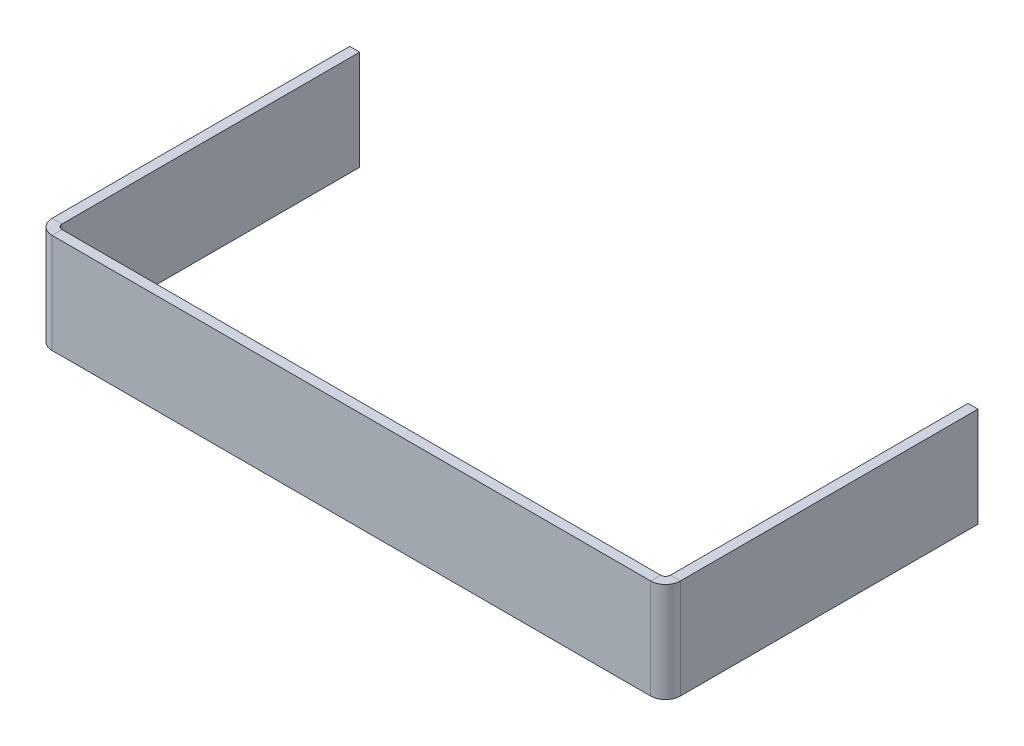
ISO-10303-21;
HEADER;
FILE_DESCRIPTION(('STEP AP214'),'2;1');
FILE_NAME('part.step','',(''),(''),'','','');
FILE_SCHEMA(('AUTOMOTIVE_DESIGN { 1 0 10303 214 1 1 1 1 }'));
ENDSEC;
DATA;
#1=APPLICATION_CONTEXT('core data for automotive mechanical design processes');
#2=APPLICATION_PROTOCOL_DEFINITION('international standard','automotive_design',2000,#1);
#3=PRODUCT_CONTEXT('',#1,'mechanical');
#4=PRODUCT('Part','Part','',(#3));
#5=PRODUCT_RELATED_PRODUCT_CATEGORY('part','',(#4));
#6=PRODUCT_DEFINITION_FORMATION('','',#4);
#7=PRODUCT_DEFINITION_CONTEXT('part definition',#1,'design');
#8=PRODUCT_DEFINITION('design','',#6,#7);
#9=PRODUCT_DEFINITION_SHAPE('','',#8);
#10=(LENGTH_UNIT() NAMED_UNIT(*) SI_UNIT(.MILLI.,.METRE.));
#11=(NAMED_UNIT(*) PLANE_ANGLE_UNIT() SI_UNIT($,.RADIAN.));
#12=(NAMED_UNIT(*) SI_UNIT($,.STERADIAN.) SOLID_ANGLE_UNIT());
#13=UNCERTAINTY_MEASURE_WITH_UNIT(LENGTH_MEASURE(1.E-05),#10,'distance_accuracy_value','');
#14=(GEOMETRIC_REPRESENTATION_CONTEXT(3) GLOBAL_UNCERTAINTY_ASSIGNED_CONTEXT((#13)) GLOBAL_UNIT_ASSIGNED_CONTEXT((#10,
#11,#12)) REPRESENTATION_CONTEXT('',''));
#15=CARTESIAN_POINT('',(0.,0.,0.));
#16=DIRECTION('',(0.,0.,1.));
#17=DIRECTION('',(1.,0.,0.));
#18=AXIS2_PLACEMENT_3D('',#15,#16,#17);
#19=CARTESIAN_POINT('',(75.,0.,43.));
#20=DIRECTION('',(0.,1.,0.));
#21=DIRECTION('',(0.,0.,1.));
#22=AXIS2_PLACEMENT_3D('',#19,#20,#21);
#23=PLANE('',#22);
#24=DIRECTION('',(0.,0.,1.));
#25=VECTOR('',#24,1.);
#26=CARTESIAN_POINT('',(-15.7634,0.,41.5000000000003));
#27=LINE('',#26,#25);
#28=CARTESIAN_POINT('',(-15.7634,0.,41.5000000000003));
#29=VERTEX_POINT('',#28);
#30=CARTESIAN_POINT('',(-15.7634,0.,43.0000000000003));
#31=VERTEX_POINT('',#30);
#32=EDGE_CURVE('E193',#29,#31,#27,.T.);
#33=ORIENTED_EDGE('',*,*,#32,.F.);
#34=DIRECTION('',(1.,0.,0.));
#35=VECTOR('',#34,1.);
#36=CARTESIAN_POINT('',(75.,0.,41.5));
#37=LINE('',#36,#35);
#38=CARTESIAN_POINT('',(74.2634,0.,41.5));
#39=VERTEX_POINT('',#38);
#40=EDGE_CURVE('E209',#29,#39,#37,.T.);
#41=ORIENTED_EDGE('',*,*,#40,.T.);
#42=DIRECTION('',(0.,0.,1.));
#43=VECTOR('',#42,1.);
#44=CARTESIAN_POINT('',(74.2634,0.,41.5));
#45=LINE('',#44,#43);
#46=CARTESIAN_POINT('',(74.2634,0.,43.));
#47=VERTEX_POINT('',#46);
#48=EDGE_CURVE('E196',#39,#47,#45,.T.);
#49=ORIENTED_EDGE('',*,*,#48,.T.);
#50=DIRECTION('',(1.,0.,0.));
#51=VECTOR('',#50,1.);
#52=CARTESIAN_POINT('',(75.,0.,43.));
#53=LINE('',#52,#51);
#54=EDGE_CURVE('E210',#31,#47,#53,.T.);
#55=ORIENTED_EDGE('',*,*,#54,.F.);
#56=EDGE_LOOP('',(#33,#41,#49,#55));
#57=FACE_BOUND('',#56,.T.);
#58=ADVANCED_FACE('F41',(#57),#23,.F.);
#59=CARTESIAN_POINT('',(-16.5,15.,43.0000000000003));
#60=DIRECTION('',(0.,-1.,0.));
#61=DIRECTION('',(0.,0.,-1.));
#62=AXIS2_PLACEMENT_3D('',#59,#60,#61);
#63=PLANE('',#62);
#64=DIRECTION('',(0.,0.,1.));
#65=VECTOR('',#64,1.);
#66=CARTESIAN_POINT('',(-15.7634,15.,41.5000000000003));
#67=LINE('',#66,#65);
#68=CARTESIAN_POINT('',(-15.7634,15.,41.5000000000003));
#69=VERTEX_POINT('',#68);
#70=CARTESIAN_POINT('',(-15.7634,15.,43.0000000000003));
#71=VERTEX_POINT('',#70);
#72=EDGE_CURVE('E187',#69,#71,#67,.T.);
#73=ORIENTED_EDGE('',*,*,#72,.T.);
#74=DIRECTION('',(-1.,0.,0.));
#75=VECTOR('',#74,1.);
#76=CARTESIAN_POINT('',(-16.5,15.,43.0000000000003));
#77=LINE('',#76,#75);
#78=CARTESIAN_POINT('',(74.2634,15.,43.));
#79=VERTEX_POINT('',#78);
#80=EDGE_CURVE('E212',#79,#71,#77,.T.);
#81=ORIENTED_EDGE('',*,*,#80,.F.);
#82=DIRECTION('',(0.,0.,1.));
#83=VECTOR('',#82,1.);
#84=CARTESIAN_POINT('',(74.2634,15.,41.5));
#85=LINE('',#84,#83);
#86=CARTESIAN_POINT('',(74.2634,15.,41.5));
#87=VERTEX_POINT('',#86);
#88=EDGE_CURVE('E201',#87,#79,#85,.T.);
#89=ORIENTED_EDGE('',*,*,#88,.F.);
#90=DIRECTION('',(-1.,0.,0.));
#91=VECTOR('',#90,1.);
#92=CARTESIAN_POINT('',(-16.5,15.,41.5000000000003));
#93=LINE('',#92,#91);
#94=EDGE_CURVE('E213',#87,#69,#93,.T.);
#95=ORIENTED_EDGE('',*,*,#94,.T.);
#96=EDGE_LOOP('',(#73,#81,#89,#95));
#97=FACE_BOUND('',#96,.T.);
#98=ADVANCED_FACE('F280',(#97),#63,.F.);
#99=CARTESIAN_POINT('',(1.50006057664647E-13,0.,43.0000000000002));
#100=DIRECTION('',(0.,0.,-1.));
#101=DIRECTION('',(-1.,0.,0.));
#102=AXIS2_PLACEMENT_3D('',#99,#100,#101);
#103=PLANE('',#102);
#104=DIRECTION('',(0.,1.,0.));
#105=VECTOR('',#104,1.);
#106=CARTESIAN_POINT('',(-15.7634,15.,43.0000000000003));
#107=LINE('',#106,#105);
#108=EDGE_CURVE('E140',#71,#31,#107,.F.);
#109=ORIENTED_EDGE('',*,*,#108,.T.);
#110=ORIENTED_EDGE('',*,*,#54,.T.);
#111=DIRECTION('',(0.,-1.,0.));
#112=VECTOR('',#111,1.);
#113=CARTESIAN_POINT('',(74.2634,0.,43.));
#114=LINE('',#113,#112);
#115=EDGE_CURVE('E204',#79,#47,#114,.T.);
#116=ORIENTED_EDGE('',*,*,#115,.F.);
#117=ORIENTED_EDGE('',*,*,#80,.T.);
#118=EDGE_LOOP('',(#109,#110,#116,#117));
#119=FACE_BOUND('',#118,.T.);
#120=ADVANCED_FACE('F278',(#119),#103,.F.);
#121=CARTESIAN_POINT('',(1.44768835656382E-13,0.,41.5000000000002));
#122=DIRECTION('',(0.,0.,-1.));
#123=DIRECTION('',(-1.,0.,0.));
#124=AXIS2_PLACEMENT_3D('',#121,#122,#123);
#125=PLANE('',#124);
#126=ORIENTED_EDGE('',*,*,#40,.F.);
#127=DIRECTION('',(0.,1.,0.));
#128=VECTOR('',#127,1.);
#129=CARTESIAN_POINT('',(-15.7634,15.,41.5000000000003));
#130=LINE('',#129,#128);
#131=EDGE_CURVE('E56',#69,#29,#130,.F.);
#132=ORIENTED_EDGE('',*,*,#131,.F.);
#133=ORIENTED_EDGE('',*,*,#94,.F.);
#134=DIRECTION('',(0.,1.,0.));
#135=VECTOR('',#134,1.);
#136=CARTESIAN_POINT('',(74.2634,0.,41.5));
#137=LINE('',#136,#135);
#138=EDGE_CURVE('E199',#39,#87,#137,.T.);
#139=ORIENTED_EDGE('',*,*,#138,.F.);
#140=EDGE_LOOP('',(#126,#132,#133,#139));
#141=FACE_BOUND('',#140,.T.);
#142=ADVANCED_FACE('F297',(#141),#125,.T.);
#143=CARTESIAN_POINT('',(76.5,15.,0.));
#144=DIRECTION('',(0.,1.,0.));
#145=DIRECTION('',(0.,0.,1.));
#146=AXIS2_PLACEMENT_3D('',#143,#144,#145);
#147=PLANE('',#146);
#148=DIRECTION('',(0.,0.,-1.));
#149=VECTOR('',#148,1.);
#150=CARTESIAN_POINT('',(75.,15.,0.));
#151=LINE('',#150,#149);
#152=CARTESIAN_POINT('',(75.,15.,40.7634));
#153=VERTEX_POINT('',#152);
#154=CARTESIAN_POINT('',(75.,15.,-4.));
#155=VERTEX_POINT('',#154);
#156=EDGE_CURVE('E242',#153,#155,#151,.T.);
#157=ORIENTED_EDGE('',*,*,#156,.F.);
#158=DIRECTION('',(1.,0.,0.));
#159=VECTOR('',#158,1.);
#160=CARTESIAN_POINT('',(75.,15.,40.7634));
#161=LINE('',#160,#159);
#162=CARTESIAN_POINT('',(76.5,15.,40.7634));
#163=VERTEX_POINT('',#162);
#164=EDGE_CURVE('E224',#153,#163,#161,.T.);
#165=ORIENTED_EDGE('',*,*,#164,.T.);
#166=DIRECTION('',(0.,0.,-1.));
#167=VECTOR('',#166,1.);
#168=CARTESIAN_POINT('',(76.5,15.,0.));
#169=LINE('',#168,#167);
#170=CARTESIAN_POINT('',(76.5,15.,-4.));
#171=VERTEX_POINT('',#170);
#172=EDGE_CURVE('E239',#163,#171,#169,.T.);
#173=ORIENTED_EDGE('',*,*,#172,.T.);
#174=DIRECTION('',(-1.,0.,0.));
#175=VECTOR('',#174,1.);
#176=CARTESIAN_POINT('',(76.5,15.,-4.));
#177=LINE('',#176,#175);
#178=EDGE_CURVE('E45',#171,#155,#177,.T.);
#179=ORIENTED_EDGE('',*,*,#178,.T.);
#180=EDGE_LOOP('',(#157,#165,#173,#179));
#181=FACE_BOUND('',#180,.T.);
#182=ADVANCED_FACE('F258',(#181),#147,.T.);
#183=CARTESIAN_POINT('',(76.5,0.,0.));
#184=DIRECTION('',(-1.,0.,0.));
#185=DIRECTION('',(0.,0.,1.));
#186=AXIS2_PLACEMENT_3D('',#183,#184,#185);
#187=PLANE('',#186);
#188=DIRECTION('',(0.,1.,0.));
#189=VECTOR('',#188,1.);
#190=CARTESIAN_POINT('',(76.5,15.,40.7634));
#191=LINE('',#190,#189);
#192=CARTESIAN_POINT('',(76.5,0.,40.7634));
#193=VERTEX_POINT('',#192);
#194=EDGE_CURVE('E218',#163,#193,#191,.F.);
#195=ORIENTED_EDGE('',*,*,#194,.T.);
#196=DIRECTION('',(0.,0.,1.));
#197=VECTOR('',#196,1.);
#198=CARTESIAN_POINT('',(76.5,0.,0.));
#199=LINE('',#198,#197);
#200=CARTESIAN_POINT('',(76.5,0.,-4.));
#201=VERTEX_POINT('',#200);
#202=EDGE_CURVE('E245',#201,#193,#199,.T.);
#203=ORIENTED_EDGE('',*,*,#202,.F.);
#204=DIRECTION('',(0.,-1.,0.));
#205=VECTOR('',#204,1.);
#206=CARTESIAN_POINT('',(76.5,15.,-4.));
#207=LINE('',#206,#205);
#208=EDGE_CURVE('E241',#171,#201,#207,.T.);
#209=ORIENTED_EDGE('',*,*,#208,.F.);
#210=ORIENTED_EDGE('',*,*,#172,.F.);
#211=EDGE_LOOP('',(#195,#203,#209,#210));
#212=FACE_BOUND('',#211,.T.);
#213=ADVANCED_FACE('F265',(#212),#187,.F.);
#214=CARTESIAN_POINT('',(75.,0.,0.));
#215=DIRECTION('',(-1.,0.,0.));
#216=DIRECTION('',(0.,0.,1.));
#217=AXIS2_PLACEMENT_3D('',#214,#215,#216);
#218=PLANE('',#217);
#219=DIRECTION('',(0.,0.,1.));
#220=VECTOR('',#219,1.);
#221=CARTESIAN_POINT('',(75.,0.,0.));
#222=LINE('',#221,#220);
#223=CARTESIAN_POINT('',(75.,0.,-4.));
#224=VERTEX_POINT('',#223);
#225=CARTESIAN_POINT('',(75.,0.,40.7634));
#226=VERTEX_POINT('',#225);
#227=EDGE_CURVE('E250',#224,#226,#222,.T.);
#228=ORIENTED_EDGE('',*,*,#227,.T.);
#229=DIRECTION('',(0.,1.,0.));
#230=VECTOR('',#229,1.);
#231=CARTESIAN_POINT('',(75.,15.,40.7634));
#232=LINE('',#231,#230);
#233=EDGE_CURVE('E64',#153,#226,#232,.F.);
#234=ORIENTED_EDGE('',*,*,#233,.F.);
#235=ORIENTED_EDGE('',*,*,#156,.T.);
#236=DIRECTION('',(0.,-1.,0.));
#237=VECTOR('',#236,1.);
#238=CARTESIAN_POINT('',(75.,15.,-4.));
#239=LINE('',#238,#237);
#240=EDGE_CURVE('E236',#155,#224,#239,.T.);
#241=ORIENTED_EDGE('',*,*,#240,.T.);
#242=EDGE_LOOP('',(#228,#234,#235,#241));
#243=FACE_BOUND('',#242,.T.);
#244=ADVANCED_FACE('F253',(#243),#218,.T.);
#245=CARTESIAN_POINT('',(76.5,0.,0.));
#246=DIRECTION('',(0.,-1.,0.));
#247=DIRECTION('',(0.,0.,-1.));
#248=AXIS2_PLACEMENT_3D('',#245,#246,#247);
#249=PLANE('',#248);
#250=DIRECTION('',(1.,0.,0.));
#251=VECTOR('',#250,1.);
#252=CARTESIAN_POINT('',(75.,0.,40.7634));
#253=LINE('',#252,#251);
#254=EDGE_CURVE('E233',#226,#193,#253,.T.);
#255=ORIENTED_EDGE('',*,*,#254,.F.);
#256=ORIENTED_EDGE('',*,*,#227,.F.);
#257=DIRECTION('',(-1.,0.,0.));
#258=VECTOR('',#257,1.);
#259=CARTESIAN_POINT('',(76.5,0.,-4.));
#260=LINE('',#259,#258);
#261=EDGE_CURVE('E11',#201,#224,#260,.T.);
#262=ORIENTED_EDGE('',*,*,#261,.F.);
#263=ORIENTED_EDGE('',*,*,#202,.T.);
#264=EDGE_LOOP('',(#255,#256,#262,#263));
#265=FACE_BOUND('',#264,.T.);
#266=ADVANCED_FACE('F263',(#265),#249,.T.);
#267=CARTESIAN_POINT('',(76.5,15.,-4.));
#268=DIRECTION('',(0.,0.,-1.));
#269=DIRECTION('',(-1.,0.,0.));
#270=AXIS2_PLACEMENT_3D('',#267,#268,#269);
#271=PLANE('',#270);
#272=ORIENTED_EDGE('',*,*,#240,.F.);
#273=ORIENTED_EDGE('',*,*,#178,.F.);
#274=ORIENTED_EDGE('',*,*,#208,.T.);
#275=ORIENTED_EDGE('',*,*,#261,.T.);
#276=EDGE_LOOP('',(#272,#273,#274,#275));
#277=FACE_BOUND('',#276,.T.);
#278=ADVANCED_FACE('F43',(#277),#271,.T.);
#279=CARTESIAN_POINT('',(74.2634,0.,40.7634));
#280=DIRECTION('',(0.,-1.,0.));
#281=DIRECTION('',(0.,0.,-1.));
#282=AXIS2_PLACEMENT_3D('',#279,#280,#281);
#283=PLANE('',#282);
#284=ORIENTED_EDGE('',*,*,#48,.F.);
#285=CARTESIAN_POINT('',(74.2634,0.,40.7634));
#286=DIRECTION('',(0.,1.,0.));
#287=DIRECTION('',(0.,0.,1.));
#288=AXIS2_PLACEMENT_3D('',#285,#286,#287);
#289=CIRCLE('',#288,0.736599999999997);
#290=EDGE_CURVE('E227',#226,#39,#289,.F.);
#291=ORIENTED_EDGE('',*,*,#290,.F.);
#292=ORIENTED_EDGE('',*,*,#254,.T.);
#293=CARTESIAN_POINT('',(74.2634,0.,40.7634));
#294=DIRECTION('',(0.,1.,0.));
#295=DIRECTION('',(0.,0.,1.));
#296=AXIS2_PLACEMENT_3D('',#293,#294,#295);
#297=CIRCLE('',#296,2.2366);
#298=EDGE_CURVE('E220',#193,#47,#297,.F.);
#299=ORIENTED_EDGE('',*,*,#298,.T.);
#300=EDGE_LOOP('',(#284,#291,#292,#299));
#301=FACE_BOUND('',#300,.T.);
#302=ADVANCED_FACE('F302',(#301),#283,.T.);
#303=CARTESIAN_POINT('',(74.2634,15.,40.7634));
#304=DIRECTION('',(0.,-1.,0.));
#305=DIRECTION('',(0.,0.,-1.));
#306=AXIS2_PLACEMENT_3D('',#303,#304,#305);
#307=PLANE('',#306);
#308=CARTESIAN_POINT('',(74.2634,15.,40.7634));
#309=DIRECTION('',(0.,1.,0.));
#310=DIRECTION('',(0.,0.,1.));
#311=AXIS2_PLACEMENT_3D('',#308,#309,#310);
#312=CIRCLE('',#311,0.736599999999997);
#313=EDGE_CURVE('E215',#87,#153,#312,.T.);
#314=ORIENTED_EDGE('',*,*,#313,.F.);
#315=ORIENTED_EDGE('',*,*,#88,.T.);
#316=CARTESIAN_POINT('',(74.2634,15.,40.7634));
#317=DIRECTION('',(0.,1.,0.));
#318=DIRECTION('',(0.,0.,1.));
#319=AXIS2_PLACEMENT_3D('',#316,#317,#318);
#320=CIRCLE('',#319,2.2366);
#321=EDGE_CURVE('E221',#79,#163,#320,.T.);
#322=ORIENTED_EDGE('',*,*,#321,.T.);
#323=ORIENTED_EDGE('',*,*,#164,.F.);
#324=EDGE_LOOP('',(#314,#315,#322,#323));
#325=FACE_BOUND('',#324,.T.);
#326=ADVANCED_FACE('F272',(#325),#307,.F.);
#327=CARTESIAN_POINT('',(74.2634,15.,40.7634));
#328=DIRECTION('',(0.,1.,0.));
#329=DIRECTION('',(0.,0.,1.));
#330=AXIS2_PLACEMENT_3D('',#327,#328,#329);
#331=CYLINDRICAL_SURFACE('',#330,2.2366);
#332=ORIENTED_EDGE('',*,*,#194,.F.);
#333=ORIENTED_EDGE('',*,*,#321,.F.);
#334=ORIENTED_EDGE('',*,*,#115,.T.);
#335=ORIENTED_EDGE('',*,*,#298,.F.);
#336=EDGE_LOOP('',(#332,#333,#334,#335));
#337=FACE_BOUND('',#336,.T.);
#338=ADVANCED_FACE('F269',(#337),#331,.T.);
#339=CARTESIAN_POINT('',(74.2634,15.,40.7634));
#340=DIRECTION('',(0.,1.,0.));
#341=DIRECTION('',(0.,0.,1.));
#342=AXIS2_PLACEMENT_3D('',#339,#340,#341);
#343=CYLINDRICAL_SURFACE('',#342,0.736599999999997);
#344=ORIENTED_EDGE('',*,*,#233,.T.);
#345=ORIENTED_EDGE('',*,*,#290,.T.);
#346=ORIENTED_EDGE('',*,*,#138,.T.);
#347=ORIENTED_EDGE('',*,*,#313,.T.);
#348=EDGE_LOOP('',(#344,#345,#346,#347));
#349=FACE_BOUND('',#348,.T.);
#350=ADVANCED_FACE('F299',(#349),#343,.F.);
#351=CARTESIAN_POINT('',(-15.7634,0.,40.7634000000003));
#352=DIRECTION('',(0.,-1.,0.));
#353=DIRECTION('',(0.,0.,-1.));
#354=AXIS2_PLACEMENT_3D('',#351,#352,#353);
#355=PLANE('',#354);
#356=DIRECTION('',(-1.,0.,0.));
#357=VECTOR('',#356,1.);
#358=CARTESIAN_POINT('',(-16.5,0.,40.7634000000003));
#359=LINE('',#358,#357);
#360=CARTESIAN_POINT('',(-16.5,0.,40.7634000000003));
#361=VERTEX_POINT('',#360);
#362=CARTESIAN_POINT('',(-18.,0.,40.7634000000003));
#363=VERTEX_POINT('',#362);
#364=EDGE_CURVE('E287',#361,#363,#359,.T.);
#365=ORIENTED_EDGE('',*,*,#364,.F.);
#366=CARTESIAN_POINT('',(-15.7634,0.,40.7634000000003));
#367=DIRECTION('',(0.,1.,0.));
#368=DIRECTION('',(0.,0.,1.));
#369=AXIS2_PLACEMENT_3D('',#366,#367,#368);
#370=CIRCLE('',#369,0.736600000000004);
#371=EDGE_CURVE('E143',#29,#361,#370,.F.);
#372=ORIENTED_EDGE('',*,*,#371,.F.);
#373=ORIENTED_EDGE('',*,*,#32,.T.);
#374=CARTESIAN_POINT('',(-15.7634,0.,40.7634000000003));
#375=DIRECTION('',(0.,1.,0.));
#376=DIRECTION('',(0.,0.,1.));
#377=AXIS2_PLACEMENT_3D('',#374,#375,#376);
#378=CIRCLE('',#377,2.2366);
#379=EDGE_CURVE('E186',#31,#363,#378,.F.);
#380=ORIENTED_EDGE('',*,*,#379,.T.);
#381=EDGE_LOOP('',(#365,#372,#373,#380));
#382=FACE_BOUND('',#381,.T.);
#383=ADVANCED_FACE('F293',(#382),#355,.T.);
#384=CARTESIAN_POINT('',(-15.7634,15.,40.7634000000003));
#385=DIRECTION('',(0.,-1.,0.));
#386=DIRECTION('',(0.,0.,-1.));
#387=AXIS2_PLACEMENT_3D('',#384,#385,#386);
#388=PLANE('',#387);
#389=CARTESIAN_POINT('',(-15.7634,15.,40.7634000000003));
#390=DIRECTION('',(0.,1.,0.));
#391=DIRECTION('',(0.,0.,1.));
#392=AXIS2_PLACEMENT_3D('',#389,#390,#391);
#393=CIRCLE('',#392,0.736600000000004);
#394=CARTESIAN_POINT('',(-16.5,15.,40.7634000000003));
#395=VERTEX_POINT('',#394);
#396=EDGE_CURVE('E150',#395,#69,#393,.T.);
#397=ORIENTED_EDGE('',*,*,#396,.F.);
#398=DIRECTION('',(-1.,0.,0.));
#399=VECTOR('',#398,1.);
#400=CARTESIAN_POINT('',(-16.5,15.,40.7634000000003));
#401=LINE('',#400,#399);
#402=CARTESIAN_POINT('',(-18.,15.,40.7634000000003));
#403=VERTEX_POINT('',#402);
#404=EDGE_CURVE('E147',#395,#403,#401,.T.);
#405=ORIENTED_EDGE('',*,*,#404,.T.);
#406=CARTESIAN_POINT('',(-15.7634,15.,40.7634000000003));
#407=DIRECTION('',(0.,1.,0.));
#408=DIRECTION('',(0.,0.,1.));
#409=AXIS2_PLACEMENT_3D('',#406,#407,#408);
#410=CIRCLE('',#409,2.2366);
#411=EDGE_CURVE('E133',#403,#71,#410,.T.);
#412=ORIENTED_EDGE('',*,*,#411,.T.);
#413=ORIENTED_EDGE('',*,*,#72,.F.);
#414=EDGE_LOOP('',(#397,#405,#412,#413));
#415=FACE_BOUND('',#414,.T.);
#416=ADVANCED_FACE('F148',(#415),#388,.F.);
#417=CARTESIAN_POINT('',(-15.7634,15.,40.7634000000003));
#418=DIRECTION('',(0.,1.,0.));
#419=DIRECTION('',(-1.,0.,0.));
#420=AXIS2_PLACEMENT_3D('',#417,#418,#419);
#421=CYLINDRICAL_SURFACE('',#420,2.2366);
#422=ORIENTED_EDGE('',*,*,#108,.F.);
#423=ORIENTED_EDGE('',*,*,#411,.F.);
#424=DIRECTION('',(0.,-1.,0.));
#425=VECTOR('',#424,1.);
#426=CARTESIAN_POINT('',(-18.,0.,40.7634000000003));
#427=LINE('',#426,#425);
#428=EDGE_CURVE('E138',#403,#363,#427,.T.);
#429=ORIENTED_EDGE('',*,*,#428,.T.);
#430=ORIENTED_EDGE('',*,*,#379,.F.);
#431=EDGE_LOOP('',(#422,#423,#429,#430));
#432=FACE_BOUND('',#431,.T.);
#433=ADVANCED_FACE('F135',(#432),#421,.T.);
#434=CARTESIAN_POINT('',(-15.7634,15.,40.7634000000003));
#435=DIRECTION('',(0.,1.,0.));
#436=DIRECTION('',(-1.,0.,0.));
#437=AXIS2_PLACEMENT_3D('',#434,#435,#436);
#438=CYLINDRICAL_SURFACE('',#437,0.736600000000004);
#439=ORIENTED_EDGE('',*,*,#131,.T.);
#440=ORIENTED_EDGE('',*,*,#371,.T.);
#441=DIRECTION('',(0.,1.,0.));
#442=VECTOR('',#441,1.);
#443=CARTESIAN_POINT('',(-16.5,0.,40.7634000000003));
#444=LINE('',#443,#442);
#445=EDGE_CURVE('E154',#361,#395,#444,.T.);
#446=ORIENTED_EDGE('',*,*,#445,.T.);
#447=ORIENTED_EDGE('',*,*,#396,.T.);
#448=EDGE_LOOP('',(#439,#440,#446,#447));
#449=FACE_BOUND('',#448,.T.);
#450=ADVANCED_FACE('F282',(#449),#438,.F.);
#451=CARTESIAN_POINT('',(-18.0000000000003,15.,-3.9999999999997));
#452=DIRECTION('',(0.,-1.,0.));
#453=DIRECTION('',(0.,0.,-1.));
#454=AXIS2_PLACEMENT_3D('',#451,#452,#453);
#455=PLANE('',#454);
#456=ORIENTED_EDGE('',*,*,#404,.F.);
#457=DIRECTION('',(0.,0.,-1.));
#458=VECTOR('',#457,1.);
#459=CARTESIAN_POINT('',(-16.5000000000003,15.,-3.99999999999971));
#460=LINE('',#459,#458);
#461=CARTESIAN_POINT('',(-16.5000000000003,15.,-3.99999999999971));
#462=VERTEX_POINT('',#461);
#463=EDGE_CURVE('E163',#395,#462,#460,.T.);
#464=ORIENTED_EDGE('',*,*,#463,.T.);
#465=DIRECTION('',(1.,0.,0.));
#466=VECTOR('',#465,1.);
#467=CARTESIAN_POINT('',(-18.0000000000003,15.,-3.9999999999997));
#468=LINE('',#467,#466);
#469=CARTESIAN_POINT('',(-18.0000000000003,15.,-3.9999999999997));
#470=VERTEX_POINT('',#469);
#471=EDGE_CURVE('E168',#470,#462,#468,.T.);
#472=ORIENTED_EDGE('',*,*,#471,.F.);
#473=DIRECTION('',(0.,0.,-1.));
#474=VECTOR('',#473,1.);
#475=CARTESIAN_POINT('',(-18.0000000000003,15.,-3.9999999999997));
#476=LINE('',#475,#474);
#477=EDGE_CURVE('E159',#403,#470,#476,.T.);
#478=ORIENTED_EDGE('',*,*,#477,.F.);
#479=EDGE_LOOP('',(#456,#464,#472,#478));
#480=FACE_BOUND('',#479,.T.);
#481=ADVANCED_FACE('F166',(#480),#455,.F.);
#482=CARTESIAN_POINT('',(-18.,0.,41.5000000000003));
#483=DIRECTION('',(0.,1.,0.));
#484=DIRECTION('',(0.,0.,1.));
#485=AXIS2_PLACEMENT_3D('',#482,#483,#484);
#486=PLANE('',#485);
#487=ORIENTED_EDGE('',*,*,#364,.T.);
#488=DIRECTION('',(0.,0.,1.));
#489=VECTOR('',#488,1.);
#490=CARTESIAN_POINT('',(-18.,0.,41.5000000000003));
#491=LINE('',#490,#489);
#492=CARTESIAN_POINT('',(-18.0000000000003,0.,-3.9999999999997));
#493=VERTEX_POINT('',#492);
#494=EDGE_CURVE('E162',#493,#363,#491,.T.);
#495=ORIENTED_EDGE('',*,*,#494,.F.);
#496=DIRECTION('',(1.,0.,0.));
#497=VECTOR('',#496,1.);
#498=CARTESIAN_POINT('',(-18.0000000000003,0.,-3.9999999999997));
#499=LINE('',#498,#497);
#500=CARTESIAN_POINT('',(-16.5000000000003,0.,-3.99999999999971));
#501=VERTEX_POINT('',#500);
#502=EDGE_CURVE('E179',#493,#501,#499,.T.);
#503=ORIENTED_EDGE('',*,*,#502,.T.);
#504=DIRECTION('',(0.,0.,1.));
#505=VECTOR('',#504,1.);
#506=CARTESIAN_POINT('',(-16.5,0.,41.5000000000003));
#507=LINE('',#506,#505);
#508=EDGE_CURVE('E170',#501,#361,#507,.T.);
#509=ORIENTED_EDGE('',*,*,#508,.T.);
#510=EDGE_LOOP('',(#487,#495,#503,#509));
#511=FACE_BOUND('',#510,.T.);
#512=ADVANCED_FACE('F291',(#511),#486,.F.);
#513=CARTESIAN_POINT('',(-18.0000000000003,0.,1.26219731032903E-13));
#514=DIRECTION('',(1.,0.,0.));
#515=DIRECTION('',(0.,0.,-1.));
#516=AXIS2_PLACEMENT_3D('',#513,#514,#515);
#517=PLANE('',#516);
#518=ORIENTED_EDGE('',*,*,#428,.F.);
#519=ORIENTED_EDGE('',*,*,#477,.T.);
#520=DIRECTION('',(0.,-1.,0.));
#521=VECTOR('',#520,1.);
#522=CARTESIAN_POINT('',(-18.0000000000003,0.,-3.9999999999997));
#523=LINE('',#522,#521);
#524=EDGE_CURVE('E169',#470,#493,#523,.T.);
#525=ORIENTED_EDGE('',*,*,#524,.T.);
#526=ORIENTED_EDGE('',*,*,#494,.T.);
#527=EDGE_LOOP('',(#518,#519,#525,#526));
#528=FACE_BOUND('',#527,.T.);
#529=ADVANCED_FACE('F158',(#528),#517,.F.);
#530=CARTESIAN_POINT('',(-16.5000000000003,0.,1.15749900506938E-13));
#531=DIRECTION('',(1.,0.,0.));
#532=DIRECTION('',(0.,0.,-1.));
#533=AXIS2_PLACEMENT_3D('',#530,#531,#532);
#534=PLANE('',#533);
#535=ORIENTED_EDGE('',*,*,#463,.F.);
#536=ORIENTED_EDGE('',*,*,#445,.F.);
#537=ORIENTED_EDGE('',*,*,#508,.F.);
#538=DIRECTION('',(0.,-1.,0.));
#539=VECTOR('',#538,1.);
#540=CARTESIAN_POINT('',(-16.5000000000003,0.,-3.99999999999971));
#541=LINE('',#540,#539);
#542=EDGE_CURVE('E174',#462,#501,#541,.T.);
#543=ORIENTED_EDGE('',*,*,#542,.F.);
#544=EDGE_LOOP('',(#535,#536,#537,#543));
#545=FACE_BOUND('',#544,.T.);
#546=ADVANCED_FACE('F487',(#545),#534,.T.);
#547=CARTESIAN_POINT('',(-18.0000000000003,0.,-3.9999999999997));
#548=DIRECTION('',(0.,0.,1.));
#549=DIRECTION('',(1.,0.,0.));
#550=AXIS2_PLACEMENT_3D('',#547,#548,#549);
#551=PLANE('',#550);
#552=ORIENTED_EDGE('',*,*,#542,.T.);
#553=ORIENTED_EDGE('',*,*,#502,.F.);
#554=ORIENTED_EDGE('',*,*,#524,.F.);
#555=ORIENTED_EDGE('',*,*,#471,.T.);
#556=EDGE_LOOP('',(#552,#553,#554,#555));
#557=FACE_BOUND('',#556,.T.);
#558=ADVANCED_FACE('F497',(#557),#551,.F.);
#559=CLOSED_SHELL('',(#58,#98,#120,#142,#182,#213,#244,#266,#278,#302,#326,#338,#350,#383,#416,
#433,#450,#481,#512,#529,#546,#558));
#560=MANIFOLD_SOLID_BREP('B2',#559);
#561=ADVANCED_BREP_SHAPE_REPRESENTATION('',(#18,#560),#14);
#562=SHAPE_DEFINITION_REPRESENTATION(#9,#561);
ENDSEC;
END-ISO-10303-21;
